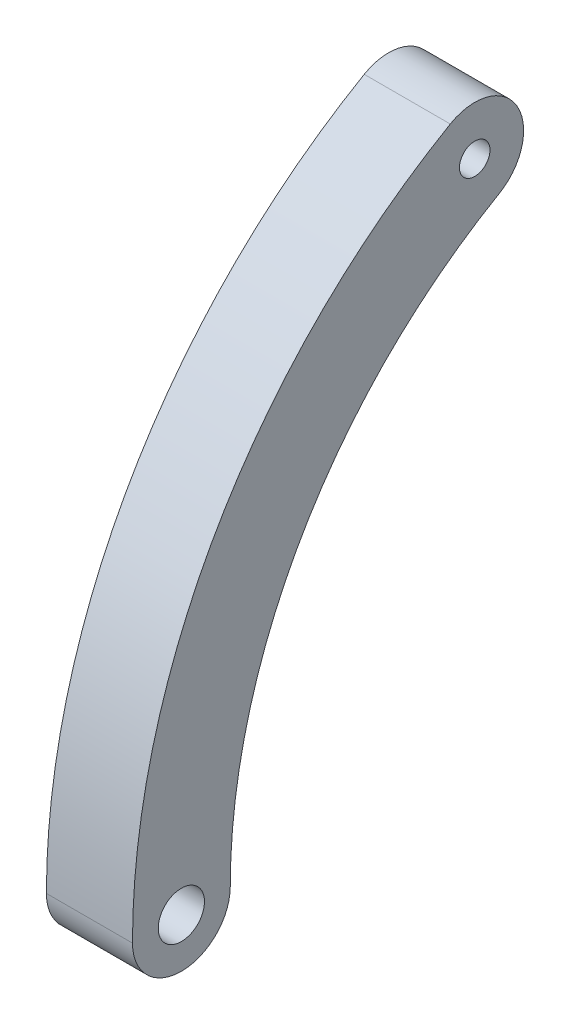
ISO-10303-21;
HEADER;
FILE_DESCRIPTION(('STEP AP214'),'2;1');
FILE_NAME('part.step','',(''),(''),'','','');
FILE_SCHEMA(('AUTOMOTIVE_DESIGN { 1 0 10303 214 1 1 1 1 }'));
ENDSEC;
DATA;
#1=APPLICATION_CONTEXT('core data for automotive mechanical design processes');
#2=APPLICATION_PROTOCOL_DEFINITION('international standard','automotive_design',2000,#1);
#3=PRODUCT_CONTEXT('',#1,'mechanical');
#4=PRODUCT('Part','Part','',(#3));
#5=PRODUCT_RELATED_PRODUCT_CATEGORY('part','',(#4));
#6=PRODUCT_DEFINITION_FORMATION('','',#4);
#7=PRODUCT_DEFINITION_CONTEXT('part definition',#1,'design');
#8=PRODUCT_DEFINITION('design','',#6,#7);
#9=PRODUCT_DEFINITION_SHAPE('','',#8);
#10=(LENGTH_UNIT() NAMED_UNIT(*) SI_UNIT(.MILLI.,.METRE.));
#11=(NAMED_UNIT(*) PLANE_ANGLE_UNIT() SI_UNIT($,.RADIAN.));
#12=(NAMED_UNIT(*) SI_UNIT($,.STERADIAN.) SOLID_ANGLE_UNIT());
#13=UNCERTAINTY_MEASURE_WITH_UNIT(LENGTH_MEASURE(1.E-05),#10,'distance_accuracy_value','');
#14=(GEOMETRIC_REPRESENTATION_CONTEXT(3) GLOBAL_UNCERTAINTY_ASSIGNED_CONTEXT((#13)) GLOBAL_UNIT_ASSIGNED_CONTEXT((#10,
#11,#12)) REPRESENTATION_CONTEXT('',''));
#15=CARTESIAN_POINT('',(0.,0.,0.));
#16=DIRECTION('',(0.,0.,1.));
#17=DIRECTION('',(1.,0.,0.));
#18=AXIS2_PLACEMENT_3D('',#15,#16,#17);
#19=CARTESIAN_POINT('',(5.588,0.,19.05));
#20=DIRECTION('',(1.,0.,0.));
#21=DIRECTION('',(0.,0.,-1.));
#22=AXIS2_PLACEMENT_3D('',#19,#20,#21);
#23=PLANE('',#22);
#24=CARTESIAN_POINT('',(5.588,32.9955678841871,19.05));
#25=DIRECTION('',(1.,0.,0.));
#26=DIRECTION('',(0.,0.,-1.));
#27=AXIS2_PLACEMENT_3D('',#24,#25,#26);
#28=CIRCLE('',#27,0.992187499999997);
#29=CARTESIAN_POINT('',(5.588,32.9955678841871,18.0578125));
#30=VERTEX_POINT('',#29);
#31=EDGE_CURVE('E114',#30,#30,#28,.T.);
#32=ORIENTED_EDGE('',*,*,#31,.F.);
#33=EDGE_LOOP('',(#32));
#34=FACE_BOUND('',#33,.T.);
#35=CARTESIAN_POINT('',(5.588,0.,38.1));
#36=DIRECTION('',(1.,0.,0.));
#37=DIRECTION('',(0.,0.,-1.));
#38=AXIS2_PLACEMENT_3D('',#35,#36,#37);
#39=CIRCLE('',#38,3.175);
#40=CARTESIAN_POINT('',(5.588,0.,41.275));
#41=VERTEX_POINT('',#40);
#42=CARTESIAN_POINT('',(5.588,0.,34.925));
#43=VERTEX_POINT('',#42);
#44=EDGE_CURVE('E94',#41,#43,#39,.T.);
#45=ORIENTED_EDGE('',*,*,#44,.T.);
#46=CARTESIAN_POINT('',(5.588,0.,0.));
#47=DIRECTION('',(-1.,0.,0.));
#48=DIRECTION('',(0.,0.,1.));
#49=AXIS2_PLACEMENT_3D('',#46,#47,#48);
#50=CIRCLE('',#49,34.925);
#51=CARTESIAN_POINT('',(5.588,30.2459372271715,17.4625));
#52=VERTEX_POINT('',#51);
#53=EDGE_CURVE('E89',#43,#52,#50,.T.);
#54=ORIENTED_EDGE('',*,*,#53,.T.);
#55=CARTESIAN_POINT('',(5.588,32.9955678841871,19.05));
#56=DIRECTION('',(1.,0.,0.));
#57=DIRECTION('',(0.,0.,-1.));
#58=AXIS2_PLACEMENT_3D('',#55,#56,#57);
#59=CIRCLE('',#58,3.175);
#60=CARTESIAN_POINT('',(5.588,35.7451985412027,20.6375));
#61=VERTEX_POINT('',#60);
#62=EDGE_CURVE('E92',#52,#61,#59,.T.);
#63=ORIENTED_EDGE('',*,*,#62,.T.);
#64=CARTESIAN_POINT('',(5.588,0.,0.));
#65=DIRECTION('',(1.,0.,0.));
#66=DIRECTION('',(0.,0.,1.));
#67=AXIS2_PLACEMENT_3D('',#64,#65,#66);
#68=CIRCLE('',#67,41.275);
#69=EDGE_CURVE('E59',#61,#41,#68,.T.);
#70=ORIENTED_EDGE('',*,*,#69,.T.);
#71=EDGE_LOOP('',(#45,#54,#63,#70));
#72=FACE_BOUND('',#71,.T.);
#73=CARTESIAN_POINT('',(5.588,0.,38.1));
#74=DIRECTION('',(1.,0.,0.));
#75=DIRECTION('',(0.,0.,-1.));
#76=AXIS2_PLACEMENT_3D('',#73,#74,#75);
#77=CIRCLE('',#76,1.5);
#78=CARTESIAN_POINT('',(5.588,0.,36.6));
#79=VERTEX_POINT('',#78);
#80=EDGE_CURVE('E136',#79,#79,#77,.T.);
#81=ORIENTED_EDGE('',*,*,#80,.F.);
#82=EDGE_LOOP('',(#81));
#83=FACE_BOUND('',#82,.T.);
#84=ADVANCED_FACE('F41',(#34,#72,#83),#23,.T.);
#85=CARTESIAN_POINT('',(0.,0.,19.05));
#86=DIRECTION('',(1.,0.,0.));
#87=DIRECTION('',(0.,0.,-1.));
#88=AXIS2_PLACEMENT_3D('',#85,#86,#87);
#89=PLANE('',#88);
#90=CARTESIAN_POINT('',(0.,0.,38.1));
#91=DIRECTION('',(1.,0.,0.));
#92=DIRECTION('',(0.,0.,-1.));
#93=AXIS2_PLACEMENT_3D('',#90,#91,#92);
#94=CIRCLE('',#93,3.175);
#95=CARTESIAN_POINT('',(0.,0.,41.275));
#96=VERTEX_POINT('',#95);
#97=CARTESIAN_POINT('',(0.,0.,34.925));
#98=VERTEX_POINT('',#97);
#99=EDGE_CURVE('E110',#96,#98,#94,.T.);
#100=ORIENTED_EDGE('',*,*,#99,.F.);
#101=CARTESIAN_POINT('',(0.,0.,0.));
#102=DIRECTION('',(1.,0.,0.));
#103=DIRECTION('',(0.,0.,1.));
#104=AXIS2_PLACEMENT_3D('',#101,#102,#103);
#105=CIRCLE('',#104,41.275);
#106=CARTESIAN_POINT('',(0.,35.7451985412027,20.6375));
#107=VERTEX_POINT('',#106);
#108=EDGE_CURVE('E82',#107,#96,#105,.T.);
#109=ORIENTED_EDGE('',*,*,#108,.F.);
#110=CARTESIAN_POINT('',(0.,32.9955678841871,19.05));
#111=DIRECTION('',(1.,0.,0.));
#112=DIRECTION('',(0.,0.,-1.));
#113=AXIS2_PLACEMENT_3D('',#110,#111,#112);
#114=CIRCLE('',#113,3.175);
#115=CARTESIAN_POINT('',(0.,30.2459372271715,17.4625));
#116=VERTEX_POINT('',#115);
#117=EDGE_CURVE('E76',#116,#107,#114,.T.);
#118=ORIENTED_EDGE('',*,*,#117,.F.);
#119=CARTESIAN_POINT('',(0.,0.,0.));
#120=DIRECTION('',(-1.,0.,0.));
#121=DIRECTION('',(0.,0.,1.));
#122=AXIS2_PLACEMENT_3D('',#119,#120,#121);
#123=CIRCLE('',#122,34.925);
#124=EDGE_CURVE('E99',#98,#116,#123,.T.);
#125=ORIENTED_EDGE('',*,*,#124,.F.);
#126=EDGE_LOOP('',(#100,#109,#118,#125));
#127=FACE_BOUND('',#126,.T.);
#128=CARTESIAN_POINT('',(0.,32.9955678841871,19.05));
#129=DIRECTION('',(1.,0.,0.));
#130=DIRECTION('',(0.,0.,-1.));
#131=AXIS2_PLACEMENT_3D('',#128,#129,#130);
#132=CIRCLE('',#131,0.992187499999997);
#133=CARTESIAN_POINT('',(0.,32.9955678841871,18.0578125));
#134=VERTEX_POINT('',#133);
#135=EDGE_CURVE('E132',#134,#134,#132,.T.);
#136=ORIENTED_EDGE('',*,*,#135,.T.);
#137=EDGE_LOOP('',(#136));
#138=FACE_BOUND('',#137,.T.);
#139=CARTESIAN_POINT('',(0.,0.,38.1));
#140=DIRECTION('',(1.,0.,0.));
#141=DIRECTION('',(0.,0.,-1.));
#142=AXIS2_PLACEMENT_3D('',#139,#140,#141);
#143=CIRCLE('',#142,1.5);
#144=CARTESIAN_POINT('',(0.,0.,36.6));
#145=VERTEX_POINT('',#144);
#146=EDGE_CURVE('E140',#145,#145,#143,.T.);
#147=ORIENTED_EDGE('',*,*,#146,.T.);
#148=EDGE_LOOP('',(#147));
#149=FACE_BOUND('',#148,.T.);
#150=ADVANCED_FACE('F127',(#127,#138,#149),#89,.F.);
#151=CARTESIAN_POINT('',(5.588,0.,38.1));
#152=DIRECTION('',(-1.,0.,0.));
#153=DIRECTION('',(0.,0.,1.));
#154=AXIS2_PLACEMENT_3D('',#151,#152,#153);
#155=CYLINDRICAL_SURFACE('',#154,3.175);
#156=ORIENTED_EDGE('',*,*,#99,.T.);
#157=DIRECTION('',(-1.,0.,0.));
#158=VECTOR('',#157,1.);
#159=CARTESIAN_POINT('',(5.588,0.,34.925));
#160=LINE('',#159,#158);
#161=EDGE_CURVE('E11',#43,#98,#160,.T.);
#162=ORIENTED_EDGE('',*,*,#161,.F.);
#163=ORIENTED_EDGE('',*,*,#44,.F.);
#164=DIRECTION('',(-1.,0.,0.));
#165=VECTOR('',#164,1.);
#166=CARTESIAN_POINT('',(5.588,0.,41.275));
#167=LINE('',#166,#165);
#168=EDGE_CURVE('E106',#41,#96,#167,.T.);
#169=ORIENTED_EDGE('',*,*,#168,.T.);
#170=EDGE_LOOP('',(#156,#162,#163,#169));
#171=FACE_BOUND('',#170,.T.);
#172=ADVANCED_FACE('F43',(#171),#155,.T.);
#173=CARTESIAN_POINT('',(5.588,0.,0.));
#174=DIRECTION('',(-1.,0.,0.));
#175=DIRECTION('',(0.,0.,1.));
#176=AXIS2_PLACEMENT_3D('',#173,#174,#175);
#177=CYLINDRICAL_SURFACE('',#176,34.925);
#178=ORIENTED_EDGE('',*,*,#124,.T.);
#179=DIRECTION('',(-1.,0.,0.));
#180=VECTOR('',#179,1.);
#181=CARTESIAN_POINT('',(5.588,30.2459372271715,17.4625));
#182=LINE('',#181,#180);
#183=EDGE_CURVE('E51',#52,#116,#182,.T.);
#184=ORIENTED_EDGE('',*,*,#183,.F.);
#185=ORIENTED_EDGE('',*,*,#53,.F.);
#186=ORIENTED_EDGE('',*,*,#161,.T.);
#187=EDGE_LOOP('',(#178,#184,#185,#186));
#188=FACE_BOUND('',#187,.T.);
#189=ADVANCED_FACE('F98',(#188),#177,.F.);
#190=CARTESIAN_POINT('',(5.588,32.9955678841871,19.05));
#191=DIRECTION('',(-1.,0.,0.));
#192=DIRECTION('',(0.,0.,1.));
#193=AXIS2_PLACEMENT_3D('',#190,#191,#192);
#194=CYLINDRICAL_SURFACE('',#193,3.175);
#195=ORIENTED_EDGE('',*,*,#117,.T.);
#196=DIRECTION('',(-1.,0.,0.));
#197=VECTOR('',#196,1.);
#198=CARTESIAN_POINT('',(5.588,35.7451985412027,20.6375));
#199=LINE('',#198,#197);
#200=EDGE_CURVE('E101',#61,#107,#199,.T.);
#201=ORIENTED_EDGE('',*,*,#200,.F.);
#202=ORIENTED_EDGE('',*,*,#62,.F.);
#203=ORIENTED_EDGE('',*,*,#183,.T.);
#204=EDGE_LOOP('',(#195,#201,#202,#203));
#205=FACE_BOUND('',#204,.T.);
#206=ADVANCED_FACE('F102',(#205),#194,.T.);
#207=CARTESIAN_POINT('',(5.588,0.,0.));
#208=DIRECTION('',(-1.,0.,0.));
#209=DIRECTION('',(0.,0.,1.));
#210=AXIS2_PLACEMENT_3D('',#207,#208,#209);
#211=CYLINDRICAL_SURFACE('',#210,41.275);
#212=ORIENTED_EDGE('',*,*,#108,.T.);
#213=ORIENTED_EDGE('',*,*,#168,.F.);
#214=ORIENTED_EDGE('',*,*,#69,.F.);
#215=ORIENTED_EDGE('',*,*,#200,.T.);
#216=EDGE_LOOP('',(#212,#213,#214,#215));
#217=FACE_BOUND('',#216,.T.);
#218=ADVANCED_FACE('F124',(#217),#211,.T.);
#219=CARTESIAN_POINT('',(5.588,32.9955678841871,19.05));
#220=DIRECTION('',(-1.,0.,0.));
#221=DIRECTION('',(0.,0.,1.));
#222=AXIS2_PLACEMENT_3D('',#219,#220,#221);
#223=CYLINDRICAL_SURFACE('',#222,0.992187499999997);
#224=ORIENTED_EDGE('',*,*,#31,.T.);
#225=EDGE_LOOP('',(#224));
#226=FACE_BOUND('',#225,.T.);
#227=ORIENTED_EDGE('',*,*,#135,.F.);
#228=EDGE_LOOP('',(#227));
#229=FACE_BOUND('',#228,.T.);
#230=ADVANCED_FACE('F159',(#226,#229),#223,.F.);
#231=CARTESIAN_POINT('',(5.588,0.,38.1));
#232=DIRECTION('',(-1.,0.,0.));
#233=DIRECTION('',(0.,0.,1.));
#234=AXIS2_PLACEMENT_3D('',#231,#232,#233);
#235=CYLINDRICAL_SURFACE('',#234,1.5);
#236=ORIENTED_EDGE('',*,*,#80,.T.);
#237=EDGE_LOOP('',(#236));
#238=FACE_BOUND('',#237,.T.);
#239=ORIENTED_EDGE('',*,*,#146,.F.);
#240=EDGE_LOOP('',(#239));
#241=FACE_BOUND('',#240,.T.);
#242=ADVANCED_FACE('F148',(#238,#241),#235,.F.);
#243=CLOSED_SHELL('',(#84,#150,#172,#189,#206,#218,#230,#242));
#244=MANIFOLD_SOLID_BREP('B2',#243);
#245=ADVANCED_BREP_SHAPE_REPRESENTATION('',(#18,#244),#14);
#246=SHAPE_DEFINITION_REPRESENTATION(#9,#245);
ENDSEC;
END-ISO-10303-21;
